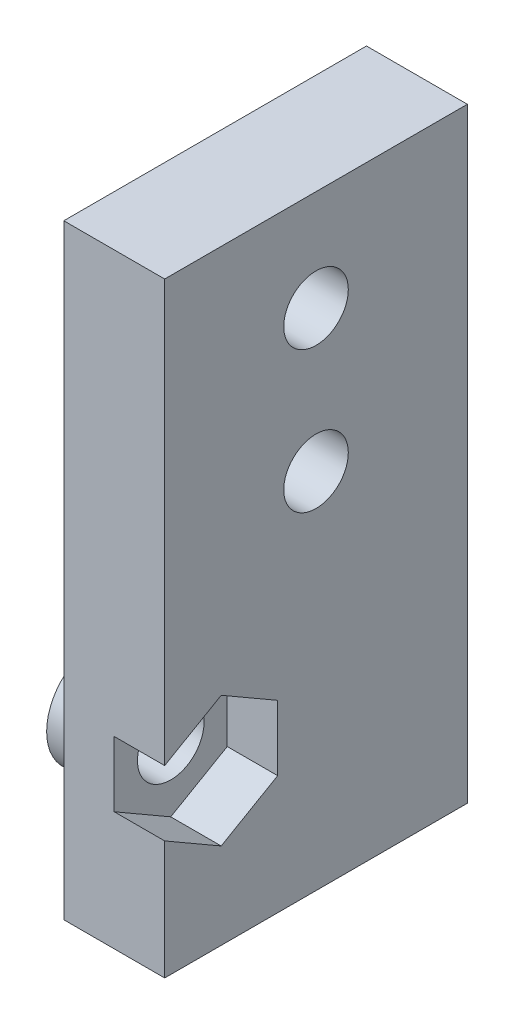
ISO-10303-21;
HEADER;
FILE_DESCRIPTION(('STEP AP214'),'2;1');
FILE_NAME('part.step','',(''),(''),'','','');
FILE_SCHEMA(('AUTOMOTIVE_DESIGN { 1 0 10303 214 1 1 1 1 }'));
ENDSEC;
DATA;
#1=APPLICATION_CONTEXT('core data for automotive mechanical design processes');
#2=APPLICATION_PROTOCOL_DEFINITION('international standard','automotive_design',2000,#1);
#3=PRODUCT_CONTEXT('',#1,'mechanical');
#4=PRODUCT('Part','Part','',(#3));
#5=PRODUCT_RELATED_PRODUCT_CATEGORY('part','',(#4));
#6=PRODUCT_DEFINITION_FORMATION('','',#4);
#7=PRODUCT_DEFINITION_CONTEXT('part definition',#1,'design');
#8=PRODUCT_DEFINITION('design','',#6,#7);
#9=PRODUCT_DEFINITION_SHAPE('','',#8);
#10=(LENGTH_UNIT() NAMED_UNIT(*) SI_UNIT(.MILLI.,.METRE.));
#11=(NAMED_UNIT(*) PLANE_ANGLE_UNIT() SI_UNIT($,.RADIAN.));
#12=(NAMED_UNIT(*) SI_UNIT($,.STERADIAN.) SOLID_ANGLE_UNIT());
#13=UNCERTAINTY_MEASURE_WITH_UNIT(LENGTH_MEASURE(1.E-05),#10,'distance_accuracy_value','');
#14=(GEOMETRIC_REPRESENTATION_CONTEXT(3) GLOBAL_UNCERTAINTY_ASSIGNED_CONTEXT((#13)) GLOBAL_UNIT_ASSIGNED_CONTEXT((#10,
#11,#12)) REPRESENTATION_CONTEXT('',''));
#15=CARTESIAN_POINT('',(0.,0.,0.));
#16=DIRECTION('',(0.,0.,1.));
#17=DIRECTION('',(1.,0.,0.));
#18=AXIS2_PLACEMENT_3D('',#15,#16,#17);
#19=CARTESIAN_POINT('',(-2.5,0.,0.));
#20=DIRECTION('',(1.,0.,0.));
#21=DIRECTION('',(0.,0.,-1.));
#22=AXIS2_PLACEMENT_3D('',#19,#20,#21);
#23=PLANE('',#22);
#24=CARTESIAN_POINT('',(-2.5,25.,-7.5));
#25=DIRECTION('',(1.,0.,0.));
#26=DIRECTION('',(0.,0.,-1.));
#27=AXIS2_PLACEMENT_3D('',#24,#25,#26);
#28=CIRCLE('',#27,1.6);
#29=CARTESIAN_POINT('',(-2.5,25.,-9.1));
#30=VERTEX_POINT('',#29);
#31=EDGE_CURVE('E206',#30,#30,#28,.T.);
#32=ORIENTED_EDGE('',*,*,#31,.T.);
#33=EDGE_LOOP('',(#32));
#34=FACE_BOUND('',#33,.T.);
#35=DIRECTION('',(0.,0.,-1.));
#36=VECTOR('',#35,1.);
#37=CARTESIAN_POINT('',(-2.5,30.,0.));
#38=LINE('',#37,#36);
#39=CARTESIAN_POINT('',(-2.5,30.,0.));
#40=VERTEX_POINT('',#39);
#41=CARTESIAN_POINT('',(-2.5,30.,-15.));
#42=VERTEX_POINT('',#41);
#43=EDGE_CURVE('E188',#40,#42,#38,.T.);
#44=ORIENTED_EDGE('',*,*,#43,.T.);
#45=DIRECTION('',(0.,1.,0.));
#46=VECTOR('',#45,1.);
#47=CARTESIAN_POINT('',(-2.5,0.,-15.));
#48=LINE('',#47,#46);
#49=CARTESIAN_POINT('',(-2.5,0.,-15.));
#50=VERTEX_POINT('',#49);
#51=EDGE_CURVE('E204',#50,#42,#48,.T.);
#52=ORIENTED_EDGE('',*,*,#51,.F.);
#53=DIRECTION('',(0.,0.,-1.));
#54=VECTOR('',#53,1.);
#55=CARTESIAN_POINT('',(-2.5,0.,0.));
#56=LINE('',#55,#54);
#57=CARTESIAN_POINT('',(-2.5,0.,0.));
#58=VERTEX_POINT('',#57);
#59=EDGE_CURVE('E191',#58,#50,#56,.T.);
#60=ORIENTED_EDGE('',*,*,#59,.F.);
#61=DIRECTION('',(0.,1.,0.));
#62=VECTOR('',#61,1.);
#63=CARTESIAN_POINT('',(-2.5,0.,0.));
#64=LINE('',#63,#62);
#65=EDGE_CURVE('E176',#58,#40,#64,.T.);
#66=ORIENTED_EDGE('',*,*,#65,.T.);
#67=EDGE_LOOP('',(#44,#52,#60,#66));
#68=FACE_BOUND('',#67,.T.);
#69=CARTESIAN_POINT('',(-2.5,18.,-7.5));
#70=DIRECTION('',(1.,0.,0.));
#71=DIRECTION('',(0.,0.,-1.));
#72=AXIS2_PLACEMENT_3D('',#69,#70,#71);
#73=CIRCLE('',#72,1.6);
#74=CARTESIAN_POINT('',(-2.5,18.,-9.1));
#75=VERTEX_POINT('',#74);
#76=EDGE_CURVE('E200',#75,#75,#73,.T.);
#77=ORIENTED_EDGE('',*,*,#76,.T.);
#78=EDGE_LOOP('',(#77));
#79=FACE_BOUND('',#78,.T.);
#80=CARTESIAN_POINT('',(-2.5,7.5,-2.8));
#81=DIRECTION('',(1.,0.,0.));
#82=DIRECTION('',(0.,0.,-1.));
#83=AXIS2_PLACEMENT_3D('',#80,#81,#82);
#84=CIRCLE('',#83,2.65);
#85=CARTESIAN_POINT('',(-2.5,7.5,-5.45));
#86=VERTEX_POINT('',#85);
#87=EDGE_CURVE('E12',#86,#86,#84,.F.);
#88=ORIENTED_EDGE('',*,*,#87,.F.);
#89=EDGE_LOOP('',(#88));
#90=FACE_BOUND('',#89,.T.);
#91=ADVANCED_FACE('F95',(#34,#68,#79,#90),#23,.F.);
#92=CARTESIAN_POINT('',(2.5,0.,0.));
#93=DIRECTION('',(1.,0.,0.));
#94=DIRECTION('',(0.,0.,-1.));
#95=AXIS2_PLACEMENT_3D('',#92,#93,#94);
#96=PLANE('',#95);
#97=CARTESIAN_POINT('',(2.5,18.,-7.5));
#98=DIRECTION('',(1.,0.,0.));
#99=DIRECTION('',(0.,0.,-1.));
#100=AXIS2_PLACEMENT_3D('',#97,#98,#99);
#101=CIRCLE('',#100,1.6);
#102=CARTESIAN_POINT('',(2.5,18.,-9.1));
#103=VERTEX_POINT('',#102);
#104=EDGE_CURVE('E248',#103,#103,#101,.T.);
#105=ORIENTED_EDGE('',*,*,#104,.F.);
#106=EDGE_LOOP('',(#105));
#107=FACE_BOUND('',#106,.T.);
#108=CARTESIAN_POINT('',(2.5,25.,-7.5));
#109=DIRECTION('',(1.,0.,0.));
#110=DIRECTION('',(0.,0.,-1.));
#111=AXIS2_PLACEMENT_3D('',#108,#109,#110);
#112=CIRCLE('',#111,1.6);
#113=CARTESIAN_POINT('',(2.5,25.,-9.1));
#114=VERTEX_POINT('',#113);
#115=EDGE_CURVE('E259',#114,#114,#112,.T.);
#116=ORIENTED_EDGE('',*,*,#115,.F.);
#117=EDGE_LOOP('',(#116));
#118=FACE_BOUND('',#117,.T.);
#119=DIRECTION('',(0.,0.5,-0.866025403784438));
#120=VECTOR('',#119,1.);
#121=CARTESIAN_POINT('',(2.5,4.26683849253807,-2.8));
#122=LINE('',#121,#120);
#123=CARTESIAN_POINT('',(2.5,4.26683849253807,-2.8));
#124=VERTEX_POINT('',#123);
#125=CARTESIAN_POINT('',(2.5,5.88341924626903,-5.60000000000002));
#126=VERTEX_POINT('',#125);
#127=EDGE_CURVE('E214',#124,#126,#122,.T.);
#128=ORIENTED_EDGE('',*,*,#127,.F.);
#129=DIRECTION('',(0.,-0.5,-0.866025403784438));
#130=VECTOR('',#129,1.);
#131=CARTESIAN_POINT('',(2.5,5.88341924626903,0.));
#132=LINE('',#131,#130);
#133=CARTESIAN_POINT('',(2.5,5.88341924626903,0.));
#134=VERTEX_POINT('',#133);
#135=EDGE_CURVE('E212',#134,#124,#132,.T.);
#136=ORIENTED_EDGE('',*,*,#135,.F.);
#137=DIRECTION('',(0.,1.,0.));
#138=VECTOR('',#137,1.);
#139=CARTESIAN_POINT('',(2.5,0.,0.));
#140=LINE('',#139,#138);
#141=CARTESIAN_POINT('',(2.5,0.,0.));
#142=VERTEX_POINT('',#141);
#143=EDGE_CURVE('E253',#142,#134,#140,.T.);
#144=ORIENTED_EDGE('',*,*,#143,.F.);
#145=DIRECTION('',(0.,0.,-1.));
#146=VECTOR('',#145,1.);
#147=CARTESIAN_POINT('',(2.5,0.,0.));
#148=LINE('',#147,#146);
#149=CARTESIAN_POINT('',(2.5,0.,-15.));
#150=VERTEX_POINT('',#149);
#151=EDGE_CURVE('E256',#142,#150,#148,.T.);
#152=ORIENTED_EDGE('',*,*,#151,.T.);
#153=DIRECTION('',(0.,1.,0.));
#154=VECTOR('',#153,1.);
#155=CARTESIAN_POINT('',(2.5,0.,-15.));
#156=LINE('',#155,#154);
#157=CARTESIAN_POINT('',(2.5,30.,-15.));
#158=VERTEX_POINT('',#157);
#159=EDGE_CURVE('E118',#150,#158,#156,.T.);
#160=ORIENTED_EDGE('',*,*,#159,.T.);
#161=DIRECTION('',(0.,0.,-1.));
#162=VECTOR('',#161,1.);
#163=CARTESIAN_POINT('',(2.5,30.,0.));
#164=LINE('',#163,#162);
#165=CARTESIAN_POINT('',(2.5,30.,0.));
#166=VERTEX_POINT('',#165);
#167=EDGE_CURVE('E251',#166,#158,#164,.T.);
#168=ORIENTED_EDGE('',*,*,#167,.F.);
#169=CARTESIAN_POINT('',(2.5,9.11658075373096,0.));
#170=VERTEX_POINT('',#169);
#171=EDGE_CURVE('E179',#170,#166,#140,.T.);
#172=ORIENTED_EDGE('',*,*,#171,.F.);
#173=DIRECTION('',(0.,-0.5,0.866025403784439));
#174=VECTOR('',#173,1.);
#175=CARTESIAN_POINT('',(2.5,10.7331615074619,-2.8));
#176=LINE('',#175,#174);
#177=CARTESIAN_POINT('',(2.5,10.7331615074619,-2.8));
#178=VERTEX_POINT('',#177);
#179=EDGE_CURVE('E110',#178,#170,#176,.T.);
#180=ORIENTED_EDGE('',*,*,#179,.F.);
#181=DIRECTION('',(0.,0.5,0.866025403784439));
#182=VECTOR('',#181,1.);
#183=CARTESIAN_POINT('',(2.5,9.11658075373097,-5.60000000000002));
#184=LINE('',#183,#182);
#185=CARTESIAN_POINT('',(2.5,9.11658075373097,-5.60000000000002));
#186=VERTEX_POINT('',#185);
#187=EDGE_CURVE('E219',#186,#178,#184,.T.);
#188=ORIENTED_EDGE('',*,*,#187,.F.);
#189=DIRECTION('',(0.,1.,0.));
#190=VECTOR('',#189,1.);
#191=CARTESIAN_POINT('',(2.5,5.88341924626903,-5.60000000000002));
#192=LINE('',#191,#190);
#193=EDGE_CURVE('E217',#126,#186,#192,.T.);
#194=ORIENTED_EDGE('',*,*,#193,.F.);
#195=EDGE_LOOP('',(#128,#136,#144,#152,#160,#168,#172,#180,#188,#194));
#196=FACE_BOUND('',#195,.T.);
#197=ADVANCED_FACE('F273',(#107,#118,#196),#96,.T.);
#198=CARTESIAN_POINT('',(2.5,0.,0.));
#199=DIRECTION('',(0.,0.,1.));
#200=DIRECTION('',(1.,0.,0.));
#201=AXIS2_PLACEMENT_3D('',#198,#199,#200);
#202=PLANE('',#201);
#203=DIRECTION('',(-1.,0.,0.));
#204=VECTOR('',#203,1.);
#205=CARTESIAN_POINT('',(2.5,30.,0.));
#206=LINE('',#205,#204);
#207=EDGE_CURVE('E103',#166,#40,#206,.T.);
#208=ORIENTED_EDGE('',*,*,#207,.T.);
#209=ORIENTED_EDGE('',*,*,#65,.F.);
#210=DIRECTION('',(-1.,0.,0.));
#211=VECTOR('',#210,1.);
#212=CARTESIAN_POINT('',(2.5,0.,0.));
#213=LINE('',#212,#211);
#214=EDGE_CURVE('E183',#142,#58,#213,.T.);
#215=ORIENTED_EDGE('',*,*,#214,.F.);
#216=ORIENTED_EDGE('',*,*,#143,.T.);
#217=DIRECTION('',(-1.,0.,0.));
#218=VECTOR('',#217,1.);
#219=CARTESIAN_POINT('',(2.5,5.88341924626903,0.));
#220=LINE('',#219,#218);
#221=CARTESIAN_POINT('',(0.,5.88341924626903,0.));
#222=VERTEX_POINT('',#221);
#223=EDGE_CURVE('E245',#134,#222,#220,.T.);
#224=ORIENTED_EDGE('',*,*,#223,.T.);
#225=DIRECTION('',(0.,1.,0.));
#226=VECTOR('',#225,1.);
#227=CARTESIAN_POINT('',(0.,0.,0.));
#228=LINE('',#227,#226);
#229=CARTESIAN_POINT('',(0.,9.11658075373098,0.));
#230=VERTEX_POINT('',#229);
#231=EDGE_CURVE('E197',#222,#230,#228,.T.);
#232=ORIENTED_EDGE('',*,*,#231,.T.);
#233=DIRECTION('',(-1.,0.,0.));
#234=VECTOR('',#233,1.);
#235=CARTESIAN_POINT('',(2.5,9.11658075373096,0.));
#236=LINE('',#235,#234);
#237=EDGE_CURVE('E222',#170,#230,#236,.T.);
#238=ORIENTED_EDGE('',*,*,#237,.F.);
#239=ORIENTED_EDGE('',*,*,#171,.T.);
#240=EDGE_LOOP('',(#208,#209,#215,#216,#224,#232,#238,#239));
#241=FACE_BOUND('',#240,.T.);
#242=ADVANCED_FACE('F175',(#241),#202,.T.);
#243=CARTESIAN_POINT('',(2.5,30.,0.));
#244=DIRECTION('',(0.,1.,0.));
#245=DIRECTION('',(0.,0.,1.));
#246=AXIS2_PLACEMENT_3D('',#243,#244,#245);
#247=PLANE('',#246);
#248=DIRECTION('',(-1.,0.,0.));
#249=VECTOR('',#248,1.);
#250=CARTESIAN_POINT('',(2.5,30.,-15.));
#251=LINE('',#250,#249);
#252=EDGE_CURVE('E193',#158,#42,#251,.T.);
#253=ORIENTED_EDGE('',*,*,#252,.T.);
#254=ORIENTED_EDGE('',*,*,#43,.F.);
#255=ORIENTED_EDGE('',*,*,#207,.F.);
#256=ORIENTED_EDGE('',*,*,#167,.T.);
#257=EDGE_LOOP('',(#253,#254,#255,#256));
#258=FACE_BOUND('',#257,.T.);
#259=ADVANCED_FACE('F97',(#258),#247,.T.);
#260=CARTESIAN_POINT('',(2.5,0.,0.));
#261=DIRECTION('',(0.,1.,0.));
#262=DIRECTION('',(0.,0.,1.));
#263=AXIS2_PLACEMENT_3D('',#260,#261,#262);
#264=PLANE('',#263);
#265=ORIENTED_EDGE('',*,*,#214,.T.);
#266=ORIENTED_EDGE('',*,*,#59,.T.);
#267=DIRECTION('',(-1.,0.,0.));
#268=VECTOR('',#267,1.);
#269=CARTESIAN_POINT('',(2.5,0.,-15.));
#270=LINE('',#269,#268);
#271=EDGE_CURVE('E263',#150,#50,#270,.T.);
#272=ORIENTED_EDGE('',*,*,#271,.F.);
#273=ORIENTED_EDGE('',*,*,#151,.F.);
#274=EDGE_LOOP('',(#265,#266,#272,#273));
#275=FACE_BOUND('',#274,.T.);
#276=ADVANCED_FACE('F267',(#275),#264,.F.);
#277=CARTESIAN_POINT('',(2.5,25.,-7.5));
#278=DIRECTION('',(-1.,0.,0.));
#279=DIRECTION('',(0.,0.,1.));
#280=AXIS2_PLACEMENT_3D('',#277,#278,#279);
#281=CYLINDRICAL_SURFACE('',#280,1.6);
#282=ORIENTED_EDGE('',*,*,#115,.T.);
#283=EDGE_LOOP('',(#282));
#284=FACE_BOUND('',#283,.T.);
#285=ORIENTED_EDGE('',*,*,#31,.F.);
#286=EDGE_LOOP('',(#285));
#287=FACE_BOUND('',#286,.T.);
#288=ADVANCED_FACE('F398',(#284,#287),#281,.F.);
#289=CARTESIAN_POINT('',(2.5,0.,-15.));
#290=DIRECTION('',(0.,0.,1.));
#291=DIRECTION('',(1.,0.,0.));
#292=AXIS2_PLACEMENT_3D('',#289,#290,#291);
#293=PLANE('',#292);
#294=ORIENTED_EDGE('',*,*,#271,.T.);
#295=ORIENTED_EDGE('',*,*,#51,.T.);
#296=ORIENTED_EDGE('',*,*,#252,.F.);
#297=ORIENTED_EDGE('',*,*,#159,.F.);
#298=EDGE_LOOP('',(#294,#295,#296,#297));
#299=FACE_BOUND('',#298,.T.);
#300=ADVANCED_FACE('F384',(#299),#293,.F.);
#301=CARTESIAN_POINT('',(2.5,18.,-7.5));
#302=DIRECTION('',(-1.,0.,0.));
#303=DIRECTION('',(0.,0.,1.));
#304=AXIS2_PLACEMENT_3D('',#301,#302,#303);
#305=CYLINDRICAL_SURFACE('',#304,1.6);
#306=ORIENTED_EDGE('',*,*,#104,.T.);
#307=EDGE_LOOP('',(#306));
#308=FACE_BOUND('',#307,.T.);
#309=ORIENTED_EDGE('',*,*,#76,.F.);
#310=EDGE_LOOP('',(#309));
#311=FACE_BOUND('',#310,.T.);
#312=ADVANCED_FACE('F377',(#308,#311),#305,.F.);
#313=CARTESIAN_POINT('',(2.5,5.88341924626903,0.));
#314=DIRECTION('',(0.,0.866025403784438,-0.5));
#315=DIRECTION('',(0.,0.5,0.866025403784439));
#316=AXIS2_PLACEMENT_3D('',#313,#314,#315);
#317=PLANE('',#316);
#318=DIRECTION('',(0.,-0.5,-0.866025403784438));
#319=VECTOR('',#318,1.);
#320=CARTESIAN_POINT('',(0.,5.88341924626903,0.));
#321=LINE('',#320,#319);
#322=CARTESIAN_POINT('',(0.,4.26683849253807,-2.8));
#323=VERTEX_POINT('',#322);
#324=EDGE_CURVE('E209',#222,#323,#321,.T.);
#325=ORIENTED_EDGE('',*,*,#324,.F.);
#326=ORIENTED_EDGE('',*,*,#223,.F.);
#327=ORIENTED_EDGE('',*,*,#135,.T.);
#328=DIRECTION('',(-1.,0.,0.));
#329=VECTOR('',#328,1.);
#330=CARTESIAN_POINT('',(2.5,4.26683849253807,-2.8));
#331=LINE('',#330,#329);
#332=EDGE_CURVE('E243',#124,#323,#331,.T.);
#333=ORIENTED_EDGE('',*,*,#332,.T.);
#334=EDGE_LOOP('',(#325,#326,#327,#333));
#335=FACE_BOUND('',#334,.T.);
#336=ADVANCED_FACE('F277',(#335),#317,.T.);
#337=CARTESIAN_POINT('',(2.5,4.26683849253807,-2.8));
#338=DIRECTION('',(0.,0.866025403784438,0.5));
#339=DIRECTION('',(0.,-0.5,0.866025403784439));
#340=AXIS2_PLACEMENT_3D('',#337,#338,#339);
#341=PLANE('',#340);
#342=DIRECTION('',(0.,0.5,-0.866025403784438));
#343=VECTOR('',#342,1.);
#344=CARTESIAN_POINT('',(0.,4.26683849253807,-2.8));
#345=LINE('',#344,#343);
#346=CARTESIAN_POINT('',(0.,5.88341924626903,-5.60000000000002));
#347=VERTEX_POINT('',#346);
#348=EDGE_CURVE('E225',#323,#347,#345,.T.);
#349=ORIENTED_EDGE('',*,*,#348,.F.);
#350=ORIENTED_EDGE('',*,*,#332,.F.);
#351=ORIENTED_EDGE('',*,*,#127,.T.);
#352=DIRECTION('',(-1.,0.,0.));
#353=VECTOR('',#352,1.);
#354=CARTESIAN_POINT('',(2.5,5.88341924626903,-5.60000000000002));
#355=LINE('',#354,#353);
#356=EDGE_CURVE('E241',#126,#347,#355,.T.);
#357=ORIENTED_EDGE('',*,*,#356,.T.);
#358=EDGE_LOOP('',(#349,#350,#351,#357));
#359=FACE_BOUND('',#358,.T.);
#360=ADVANCED_FACE('F280',(#359),#341,.T.);
#361=CARTESIAN_POINT('',(2.5,5.88341924626903,-5.60000000000002));
#362=DIRECTION('',(0.,0.,1.));
#363=DIRECTION('',(1.,0.,0.));
#364=AXIS2_PLACEMENT_3D('',#361,#362,#363);
#365=PLANE('',#364);
#366=DIRECTION('',(0.,1.,0.));
#367=VECTOR('',#366,1.);
#368=CARTESIAN_POINT('',(0.,5.88341924626903,-5.60000000000002));
#369=LINE('',#368,#367);
#370=CARTESIAN_POINT('',(0.,9.11658075373097,-5.60000000000002));
#371=VERTEX_POINT('',#370);
#372=EDGE_CURVE('E228',#347,#371,#369,.T.);
#373=ORIENTED_EDGE('',*,*,#372,.F.);
#374=ORIENTED_EDGE('',*,*,#356,.F.);
#375=ORIENTED_EDGE('',*,*,#193,.T.);
#376=DIRECTION('',(-1.,0.,0.));
#377=VECTOR('',#376,1.);
#378=CARTESIAN_POINT('',(2.5,9.11658075373097,-5.60000000000002));
#379=LINE('',#378,#377);
#380=EDGE_CURVE('E239',#186,#371,#379,.T.);
#381=ORIENTED_EDGE('',*,*,#380,.T.);
#382=EDGE_LOOP('',(#373,#374,#375,#381));
#383=FACE_BOUND('',#382,.T.);
#384=ADVANCED_FACE('F294',(#383),#365,.T.);
#385=CARTESIAN_POINT('',(2.5,9.11658075373097,-5.60000000000002));
#386=DIRECTION('',(0.,-0.866025403784439,0.5));
#387=DIRECTION('',(0.,-0.5,-0.866025403784439));
#388=AXIS2_PLACEMENT_3D('',#385,#386,#387);
#389=PLANE('',#388);
#390=DIRECTION('',(0.,0.5,0.866025403784439));
#391=VECTOR('',#390,1.);
#392=CARTESIAN_POINT('',(0.,9.11658075373097,-5.60000000000002));
#393=LINE('',#392,#391);
#394=CARTESIAN_POINT('',(0.,10.7331615074619,-2.8));
#395=VERTEX_POINT('',#394);
#396=EDGE_CURVE('E231',#371,#395,#393,.T.);
#397=ORIENTED_EDGE('',*,*,#396,.F.);
#398=ORIENTED_EDGE('',*,*,#380,.F.);
#399=ORIENTED_EDGE('',*,*,#187,.T.);
#400=DIRECTION('',(-1.,0.,0.));
#401=VECTOR('',#400,1.);
#402=CARTESIAN_POINT('',(2.5,10.7331615074619,-2.8));
#403=LINE('',#402,#401);
#404=EDGE_CURVE('E237',#178,#395,#403,.T.);
#405=ORIENTED_EDGE('',*,*,#404,.T.);
#406=EDGE_LOOP('',(#397,#398,#399,#405));
#407=FACE_BOUND('',#406,.T.);
#408=ADVANCED_FACE('F291',(#407),#389,.T.);
#409=CARTESIAN_POINT('',(2.5,10.7331615074619,-2.8));
#410=DIRECTION('',(0.,-0.866025403784438,-0.5));
#411=DIRECTION('',(0.,0.5,-0.866025403784438));
#412=AXIS2_PLACEMENT_3D('',#409,#410,#411);
#413=PLANE('',#412);
#414=DIRECTION('',(0.,-0.5,0.866025403784439));
#415=VECTOR('',#414,1.);
#416=CARTESIAN_POINT('',(0.,10.7331615074619,-2.8));
#417=LINE('',#416,#415);
#418=EDGE_CURVE('E215',#395,#230,#417,.T.);
#419=ORIENTED_EDGE('',*,*,#418,.F.);
#420=ORIENTED_EDGE('',*,*,#404,.F.);
#421=ORIENTED_EDGE('',*,*,#179,.T.);
#422=ORIENTED_EDGE('',*,*,#237,.T.);
#423=EDGE_LOOP('',(#419,#420,#421,#422));
#424=FACE_BOUND('',#423,.T.);
#425=ADVANCED_FACE('F292',(#424),#413,.T.);
#426=CARTESIAN_POINT('',(-2.5,7.5,-2.8));
#427=DIRECTION('',(1.,0.,0.));
#428=DIRECTION('',(0.,0.,-1.));
#429=AXIS2_PLACEMENT_3D('',#426,#427,#428);
#430=CYLINDRICAL_SURFACE('',#429,1.65);
#431=CARTESIAN_POINT('',(0.,7.5,-2.8));
#432=DIRECTION('',(1.,0.,0.));
#433=DIRECTION('',(0.,0.,-1.));
#434=AXIS2_PLACEMENT_3D('',#431,#432,#433);
#435=CIRCLE('',#434,1.65);
#436=CARTESIAN_POINT('',(0.,7.5,-4.45));
#437=VERTEX_POINT('',#436);
#438=EDGE_CURVE('E194',#437,#437,#435,.T.);
#439=ORIENTED_EDGE('',*,*,#438,.T.);
#440=EDGE_LOOP('',(#439));
#441=FACE_BOUND('',#440,.T.);
#442=CARTESIAN_POINT('',(-3.5,7.5,-2.8));
#443=DIRECTION('',(-1.,0.,0.));
#444=DIRECTION('',(0.,0.,1.));
#445=AXIS2_PLACEMENT_3D('',#442,#443,#444);
#446=CIRCLE('',#445,1.65);
#447=CARTESIAN_POINT('',(-3.5,7.5,-1.15));
#448=VERTEX_POINT('',#447);
#449=EDGE_CURVE('E501',#448,#448,#446,.T.);
#450=ORIENTED_EDGE('',*,*,#449,.T.);
#451=EDGE_LOOP('',(#450));
#452=FACE_BOUND('',#451,.T.);
#453=ADVANCED_FACE('F318',(#441,#452),#430,.F.);
#454=CARTESIAN_POINT('',(0.,0.,0.));
#455=DIRECTION('',(1.,0.,0.));
#456=DIRECTION('',(0.,0.,-1.));
#457=AXIS2_PLACEMENT_3D('',#454,#455,#456);
#458=PLANE('',#457);
#459=ORIENTED_EDGE('',*,*,#231,.F.);
#460=ORIENTED_EDGE('',*,*,#324,.T.);
#461=ORIENTED_EDGE('',*,*,#348,.T.);
#462=ORIENTED_EDGE('',*,*,#372,.T.);
#463=ORIENTED_EDGE('',*,*,#396,.T.);
#464=ORIENTED_EDGE('',*,*,#418,.T.);
#465=EDGE_LOOP('',(#459,#460,#461,#462,#463,#464));
#466=FACE_BOUND('',#465,.T.);
#467=ORIENTED_EDGE('',*,*,#438,.F.);
#468=EDGE_LOOP('',(#467));
#469=FACE_BOUND('',#468,.T.);
#470=ADVANCED_FACE('F284',(#466,#469),#458,.T.);
#471=CARTESIAN_POINT('',(-3.5,7.5,-2.8));
#472=DIRECTION('',(-1.,0.,0.));
#473=DIRECTION('',(0.,0.,1.));
#474=AXIS2_PLACEMENT_3D('',#471,#472,#473);
#475=PLANE('',#474);
#476=CARTESIAN_POINT('',(-3.5,7.5,-2.8));
#477=DIRECTION('',(-1.,0.,0.));
#478=DIRECTION('',(0.,0.,1.));
#479=AXIS2_PLACEMENT_3D('',#476,#477,#478);
#480=CIRCLE('',#479,2.65);
#481=CARTESIAN_POINT('',(-3.5,7.5,-0.15));
#482=VERTEX_POINT('',#481);
#483=EDGE_CURVE('E499',#482,#482,#480,.T.);
#484=ORIENTED_EDGE('',*,*,#483,.T.);
#485=EDGE_LOOP('',(#484));
#486=FACE_BOUND('',#485,.T.);
#487=ORIENTED_EDGE('',*,*,#449,.F.);
#488=EDGE_LOOP('',(#487));
#489=FACE_BOUND('',#488,.T.);
#490=ADVANCED_FACE('F317',(#486,#489),#475,.T.);
#491=CARTESIAN_POINT('',(-3.5,7.5,-2.8));
#492=DIRECTION('',(1.,0.,0.));
#493=DIRECTION('',(0.,0.,-1.));
#494=AXIS2_PLACEMENT_3D('',#491,#492,#493);
#495=CYLINDRICAL_SURFACE('',#494,2.65);
#496=ORIENTED_EDGE('',*,*,#483,.F.);
#497=EDGE_LOOP('',(#496));
#498=FACE_BOUND('',#497,.T.);
#499=ORIENTED_EDGE('',*,*,#87,.T.);
#500=EDGE_LOOP('',(#499));
#501=FACE_BOUND('',#500,.T.);
#502=ADVANCED_FACE('F313',(#498,#501),#495,.T.);
#503=CLOSED_SHELL('',(#91,#197,#242,#259,#276,#288,#300,#312,#336,#360,#384,#408,#425,#453,#470,
#490,#502));
#504=MANIFOLD_SOLID_BREP('B2',#503);
#505=ADVANCED_BREP_SHAPE_REPRESENTATION('',(#18,#504),#14);
#506=SHAPE_DEFINITION_REPRESENTATION(#9,#505);
ENDSEC;
END-ISO-10303-21;
